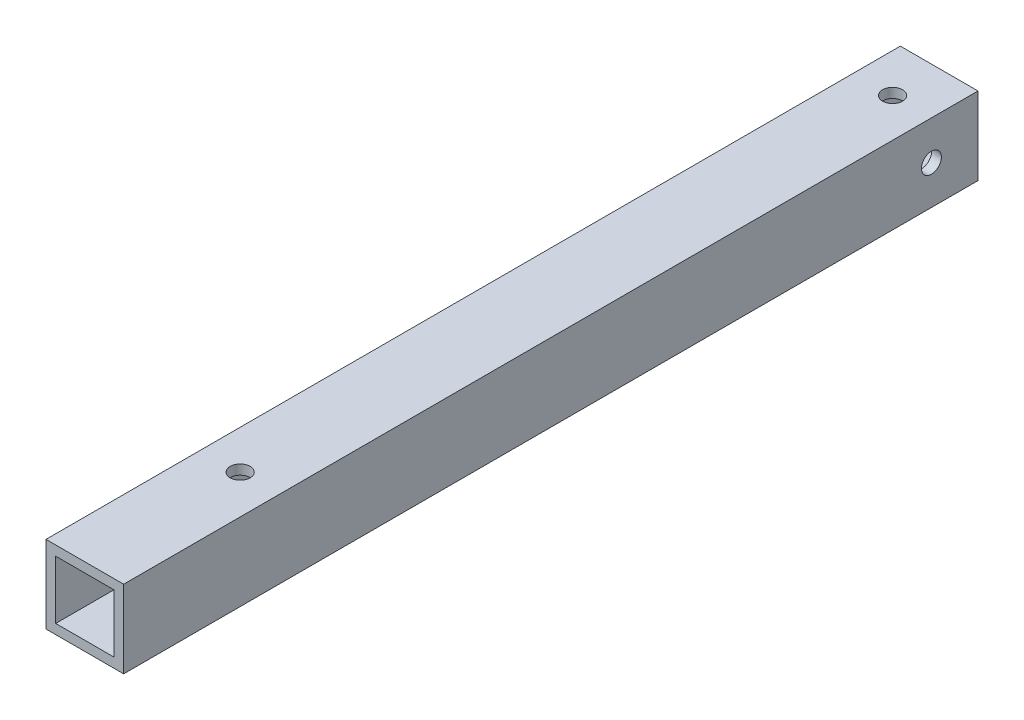
ISO-10303-21;
HEADER;
FILE_DESCRIPTION(('STEP AP214'),'2;1');
FILE_NAME('part.step','',(''),(''),'','','');
FILE_SCHEMA(('AUTOMOTIVE_DESIGN { 1 0 10303 214 1 1 1 1 }'));
ENDSEC;
DATA;
#1=APPLICATION_CONTEXT('core data for automotive mechanical design processes');
#2=APPLICATION_PROTOCOL_DEFINITION('international standard','automotive_design',2000,#1);
#3=PRODUCT_CONTEXT('',#1,'mechanical');
#4=PRODUCT('Part','Part','',(#3));
#5=PRODUCT_RELATED_PRODUCT_CATEGORY('part','',(#4));
#6=PRODUCT_DEFINITION_FORMATION('','',#4);
#7=PRODUCT_DEFINITION_CONTEXT('part definition',#1,'design');
#8=PRODUCT_DEFINITION('design','',#6,#7);
#9=PRODUCT_DEFINITION_SHAPE('','',#8);
#10=(LENGTH_UNIT() NAMED_UNIT(*) SI_UNIT(.MILLI.,.METRE.));
#11=(NAMED_UNIT(*) PLANE_ANGLE_UNIT() SI_UNIT($,.RADIAN.));
#12=(NAMED_UNIT(*) SI_UNIT($,.STERADIAN.) SOLID_ANGLE_UNIT());
#13=UNCERTAINTY_MEASURE_WITH_UNIT(LENGTH_MEASURE(1.E-05),#10,'distance_accuracy_value','');
#14=(GEOMETRIC_REPRESENTATION_CONTEXT(3) GLOBAL_UNCERTAINTY_ASSIGNED_CONTEXT((#13)) GLOBAL_UNIT_ASSIGNED_CONTEXT((#10,
#11,#12)) REPRESENTATION_CONTEXT('',''));
#15=CARTESIAN_POINT('',(0.,0.,0.));
#16=DIRECTION('',(0.,0.,1.));
#17=DIRECTION('',(1.,0.,0.));
#18=AXIS2_PLACEMENT_3D('',#15,#16,#17);
#19=CARTESIAN_POINT('',(0.,0.,279.4));
#20=DIRECTION('',(0.,0.,-1.));
#21=DIRECTION('',(-1.,0.,0.));
#22=AXIS2_PLACEMENT_3D('',#19,#20,#21);
#23=PLANE('',#22);
#24=DIRECTION('',(-1.,0.,0.));
#25=VECTOR('',#24,1.);
#26=CARTESIAN_POINT('',(12.7000000000001,-12.7,279.4));
#27=LINE('',#26,#25);
#28=CARTESIAN_POINT('',(12.7000000000001,-12.7,279.4));
#29=VERTEX_POINT('',#28);
#30=CARTESIAN_POINT('',(-12.6999999999999,-12.7,279.4));
#31=VERTEX_POINT('',#30);
#32=EDGE_CURVE('E143',#29,#31,#27,.T.);
#33=ORIENTED_EDGE('',*,*,#32,.F.);
#34=DIRECTION('',(0.,1.,0.));
#35=VECTOR('',#34,1.);
#36=CARTESIAN_POINT('',(12.7000000000001,-12.7,279.4));
#37=LINE('',#36,#35);
#38=CARTESIAN_POINT('',(12.7000000000001,12.7,279.4));
#39=VERTEX_POINT('',#38);
#40=EDGE_CURVE('E152',#29,#39,#37,.T.);
#41=ORIENTED_EDGE('',*,*,#40,.T.);
#42=DIRECTION('',(-1.,0.,0.));
#43=VECTOR('',#42,1.);
#44=CARTESIAN_POINT('',(12.7000000000001,12.7,279.4));
#45=LINE('',#44,#43);
#46=CARTESIAN_POINT('',(-12.6999999999999,12.7,279.4));
#47=VERTEX_POINT('',#46);
#48=EDGE_CURVE('E150',#39,#47,#45,.T.);
#49=ORIENTED_EDGE('',*,*,#48,.T.);
#50=DIRECTION('',(0.,1.,0.));
#51=VECTOR('',#50,1.);
#52=CARTESIAN_POINT('',(-12.6999999999999,-12.7,279.4));
#53=LINE('',#52,#51);
#54=EDGE_CURVE('E146',#31,#47,#53,.T.);
#55=ORIENTED_EDGE('',*,*,#54,.F.);
#56=EDGE_LOOP('',(#33,#41,#49,#55));
#57=FACE_BOUND('',#56,.T.);
#58=DIRECTION('',(0.,1.,0.));
#59=VECTOR('',#58,1.);
#60=CARTESIAN_POINT('',(9.52500000000005,-9.52499999999999,279.4));
#61=LINE('',#60,#59);
#62=CARTESIAN_POINT('',(9.52500000000005,-9.52499999999999,279.4));
#63=VERTEX_POINT('',#62);
#64=CARTESIAN_POINT('',(9.52500000000005,9.52499999999999,279.4));
#65=VERTEX_POINT('',#64);
#66=EDGE_CURVE('E105',#63,#65,#61,.T.);
#67=ORIENTED_EDGE('',*,*,#66,.F.);
#68=DIRECTION('',(1.,0.,0.));
#69=VECTOR('',#68,1.);
#70=CARTESIAN_POINT('',(-9.52500000000006,-9.52499999999999,279.4));
#71=LINE('',#70,#69);
#72=CARTESIAN_POINT('',(-9.52500000000006,-9.52499999999999,279.4));
#73=VERTEX_POINT('',#72);
#74=EDGE_CURVE('E127',#73,#63,#71,.T.);
#75=ORIENTED_EDGE('',*,*,#74,.F.);
#76=DIRECTION('',(0.,-1.,0.));
#77=VECTOR('',#76,1.);
#78=CARTESIAN_POINT('',(-9.52500000000006,-9.52499999999999,279.4));
#79=LINE('',#78,#77);
#80=CARTESIAN_POINT('',(-9.52500000000006,9.52499999999999,279.4));
#81=VERTEX_POINT('',#80);
#82=EDGE_CURVE('E125',#81,#73,#79,.T.);
#83=ORIENTED_EDGE('',*,*,#82,.F.);
#84=DIRECTION('',(-1.,0.,0.));
#85=VECTOR('',#84,1.);
#86=CARTESIAN_POINT('',(-9.52500000000006,9.52499999999999,279.4));
#87=LINE('',#86,#85);
#88=EDGE_CURVE('E113',#65,#81,#87,.T.);
#89=ORIENTED_EDGE('',*,*,#88,.F.);
#90=EDGE_LOOP('',(#67,#75,#83,#89));
#91=FACE_BOUND('',#90,.T.);
#92=ADVANCED_FACE('F39',(#57,#91),#23,.F.);
#93=CARTESIAN_POINT('',(0.,0.,0.));
#94=DIRECTION('',(0.,0.,-1.));
#95=DIRECTION('',(-1.,0.,0.));
#96=AXIS2_PLACEMENT_3D('',#93,#94,#95);
#97=PLANE('',#96);
#98=DIRECTION('',(-1.,0.,0.));
#99=VECTOR('',#98,1.);
#100=CARTESIAN_POINT('',(12.7000000000001,-12.7,0.));
#101=LINE('',#100,#99);
#102=CARTESIAN_POINT('',(12.7000000000001,-12.7,0.));
#103=VERTEX_POINT('',#102);
#104=CARTESIAN_POINT('',(-12.6999999999999,-12.7,0.));
#105=VERTEX_POINT('',#104);
#106=EDGE_CURVE('E121',#103,#105,#101,.T.);
#107=ORIENTED_EDGE('',*,*,#106,.T.);
#108=DIRECTION('',(0.,1.,0.));
#109=VECTOR('',#108,1.);
#110=CARTESIAN_POINT('',(-12.6999999999999,-12.7,0.));
#111=LINE('',#110,#109);
#112=CARTESIAN_POINT('',(-12.6999999999999,12.7,0.));
#113=VERTEX_POINT('',#112);
#114=EDGE_CURVE('E157',#105,#113,#111,.T.);
#115=ORIENTED_EDGE('',*,*,#114,.T.);
#116=DIRECTION('',(-1.,0.,0.));
#117=VECTOR('',#116,1.);
#118=CARTESIAN_POINT('',(12.7000000000001,12.7,0.));
#119=LINE('',#118,#117);
#120=CARTESIAN_POINT('',(12.7000000000001,12.7,0.));
#121=VERTEX_POINT('',#120);
#122=EDGE_CURVE('E160',#121,#113,#119,.T.);
#123=ORIENTED_EDGE('',*,*,#122,.F.);
#124=DIRECTION('',(0.,1.,0.));
#125=VECTOR('',#124,1.);
#126=CARTESIAN_POINT('',(12.7000000000001,-12.7,0.));
#127=LINE('',#126,#125);
#128=EDGE_CURVE('E147',#103,#121,#127,.T.);
#129=ORIENTED_EDGE('',*,*,#128,.F.);
#130=EDGE_LOOP('',(#107,#115,#123,#129));
#131=FACE_BOUND('',#130,.T.);
#132=DIRECTION('',(1.,0.,0.));
#133=VECTOR('',#132,1.);
#134=CARTESIAN_POINT('',(-9.52500000000006,-9.52499999999999,0.));
#135=LINE('',#134,#133);
#136=CARTESIAN_POINT('',(-9.52500000000006,-9.52499999999999,0.));
#137=VERTEX_POINT('',#136);
#138=CARTESIAN_POINT('',(9.52500000000005,-9.52499999999999,0.));
#139=VERTEX_POINT('',#138);
#140=EDGE_CURVE('E114',#137,#139,#135,.T.);
#141=ORIENTED_EDGE('',*,*,#140,.T.);
#142=DIRECTION('',(0.,1.,0.));
#143=VECTOR('',#142,1.);
#144=CARTESIAN_POINT('',(9.52500000000005,-9.52499999999999,0.));
#145=LINE('',#144,#143);
#146=CARTESIAN_POINT('',(9.52500000000005,9.52499999999999,0.));
#147=VERTEX_POINT('',#146);
#148=EDGE_CURVE('E64',#139,#147,#145,.T.);
#149=ORIENTED_EDGE('',*,*,#148,.T.);
#150=DIRECTION('',(-1.,0.,0.));
#151=VECTOR('',#150,1.);
#152=CARTESIAN_POINT('',(-9.52500000000006,9.52499999999999,0.));
#153=LINE('',#152,#151);
#154=CARTESIAN_POINT('',(-9.52500000000006,9.52499999999999,0.));
#155=VERTEX_POINT('',#154);
#156=EDGE_CURVE('E120',#147,#155,#153,.T.);
#157=ORIENTED_EDGE('',*,*,#156,.T.);
#158=DIRECTION('',(0.,-1.,0.));
#159=VECTOR('',#158,1.);
#160=CARTESIAN_POINT('',(-9.52500000000006,-9.52499999999999,0.));
#161=LINE('',#160,#159);
#162=EDGE_CURVE('E135',#155,#137,#161,.T.);
#163=ORIENTED_EDGE('',*,*,#162,.T.);
#164=EDGE_LOOP('',(#141,#149,#157,#163));
#165=FACE_BOUND('',#164,.T.);
#166=ADVANCED_FACE('F217',(#131,#165),#97,.T.);
#167=CARTESIAN_POINT('',(12.7000000000001,-12.7,279.4));
#168=DIRECTION('',(0.,-1.,0.));
#169=DIRECTION('',(0.,0.,-1.));
#170=AXIS2_PLACEMENT_3D('',#167,#168,#169);
#171=PLANE('',#170);
#172=CARTESIAN_POINT('',(0.,-12.7,228.6));
#173=DIRECTION('',(0.,1.,0.));
#174=DIRECTION('',(0.,0.,1.));
#175=AXIS2_PLACEMENT_3D('',#172,#173,#174);
#176=CIRCLE('',#175,3.2639);
#177=CARTESIAN_POINT('',(0.,-12.7,231.8639));
#178=VERTEX_POINT('',#177);
#179=EDGE_CURVE('E175',#178,#178,#176,.T.);
#180=ORIENTED_EDGE('',*,*,#179,.T.);
#181=EDGE_LOOP('',(#180));
#182=FACE_BOUND('',#181,.T.);
#183=CARTESIAN_POINT('',(0.,-12.7,15.24));
#184=DIRECTION('',(0.,1.,0.));
#185=DIRECTION('',(0.,0.,1.));
#186=AXIS2_PLACEMENT_3D('',#183,#184,#185);
#187=CIRCLE('',#186,3.2639);
#188=CARTESIAN_POINT('',(0.,-12.7,18.5039));
#189=VERTEX_POINT('',#188);
#190=EDGE_CURVE('E171',#189,#189,#187,.T.);
#191=ORIENTED_EDGE('',*,*,#190,.T.);
#192=EDGE_LOOP('',(#191));
#193=FACE_BOUND('',#192,.T.);
#194=ORIENTED_EDGE('',*,*,#106,.F.);
#195=DIRECTION('',(0.,0.,-1.));
#196=VECTOR('',#195,1.);
#197=CARTESIAN_POINT('',(12.7000000000001,-12.7,279.4));
#198=LINE('',#197,#196);
#199=EDGE_CURVE('E11',#29,#103,#198,.T.);
#200=ORIENTED_EDGE('',*,*,#199,.F.);
#201=ORIENTED_EDGE('',*,*,#32,.T.);
#202=DIRECTION('',(0.,0.,-1.));
#203=VECTOR('',#202,1.);
#204=CARTESIAN_POINT('',(-12.6999999999999,-12.7,279.4));
#205=LINE('',#204,#203);
#206=EDGE_CURVE('E154',#31,#105,#205,.T.);
#207=ORIENTED_EDGE('',*,*,#206,.T.);
#208=EDGE_LOOP('',(#194,#200,#201,#207));
#209=FACE_BOUND('',#208,.T.);
#210=ADVANCED_FACE('F41',(#182,#193,#209),#171,.T.);
#211=CARTESIAN_POINT('',(12.7000000000001,-12.7,279.4));
#212=DIRECTION('',(-1.,0.,0.));
#213=DIRECTION('',(0.,0.,1.));
#214=AXIS2_PLACEMENT_3D('',#211,#212,#213);
#215=PLANE('',#214);
#216=CARTESIAN_POINT('',(12.7000000000001,0.,15.24));
#217=DIRECTION('',(-1.,0.,0.));
#218=DIRECTION('',(0.,0.,1.));
#219=AXIS2_PLACEMENT_3D('',#216,#217,#218);
#220=CIRCLE('',#219,3.2639);
#221=CARTESIAN_POINT('',(12.7000000000001,0.,18.5039));
#222=VERTEX_POINT('',#221);
#223=EDGE_CURVE('E289',#222,#222,#220,.T.);
#224=ORIENTED_EDGE('',*,*,#223,.T.);
#225=EDGE_LOOP('',(#224));
#226=FACE_BOUND('',#225,.T.);
#227=ORIENTED_EDGE('',*,*,#128,.T.);
#228=DIRECTION('',(0.,0.,-1.));
#229=VECTOR('',#228,1.);
#230=CARTESIAN_POINT('',(12.7000000000001,12.7,279.4));
#231=LINE('',#230,#229);
#232=EDGE_CURVE('E48',#39,#121,#231,.T.);
#233=ORIENTED_EDGE('',*,*,#232,.F.);
#234=ORIENTED_EDGE('',*,*,#40,.F.);
#235=ORIENTED_EDGE('',*,*,#199,.T.);
#236=EDGE_LOOP('',(#227,#233,#234,#235));
#237=FACE_BOUND('',#236,.T.);
#238=ADVANCED_FACE('F227',(#226,#237),#215,.F.);
#239=CARTESIAN_POINT('',(12.7000000000001,12.7,279.4));
#240=DIRECTION('',(0.,-1.,0.));
#241=DIRECTION('',(0.,0.,-1.));
#242=AXIS2_PLACEMENT_3D('',#239,#240,#241);
#243=PLANE('',#242);
#244=CARTESIAN_POINT('',(0.,12.7,228.6));
#245=DIRECTION('',(0.,1.,0.));
#246=DIRECTION('',(0.,0.,1.));
#247=AXIS2_PLACEMENT_3D('',#244,#245,#246);
#248=CIRCLE('',#247,3.2639);
#249=CARTESIAN_POINT('',(0.,12.7,231.8639));
#250=VERTEX_POINT('',#249);
#251=EDGE_CURVE('E182',#250,#250,#248,.T.);
#252=ORIENTED_EDGE('',*,*,#251,.F.);
#253=EDGE_LOOP('',(#252));
#254=FACE_BOUND('',#253,.T.);
#255=CARTESIAN_POINT('',(0.,12.7,15.24));
#256=DIRECTION('',(0.,1.,0.));
#257=DIRECTION('',(0.,0.,1.));
#258=AXIS2_PLACEMENT_3D('',#255,#256,#257);
#259=CIRCLE('',#258,3.2639);
#260=CARTESIAN_POINT('',(0.,12.7,18.5039));
#261=VERTEX_POINT('',#260);
#262=EDGE_CURVE('E179',#261,#261,#259,.T.);
#263=ORIENTED_EDGE('',*,*,#262,.F.);
#264=EDGE_LOOP('',(#263));
#265=FACE_BOUND('',#264,.T.);
#266=ORIENTED_EDGE('',*,*,#122,.T.);
#267=DIRECTION('',(0.,0.,-1.));
#268=VECTOR('',#267,1.);
#269=CARTESIAN_POINT('',(-12.6999999999999,12.7,279.4));
#270=LINE('',#269,#268);
#271=EDGE_CURVE('E166',#47,#113,#270,.T.);
#272=ORIENTED_EDGE('',*,*,#271,.F.);
#273=ORIENTED_EDGE('',*,*,#48,.F.);
#274=ORIENTED_EDGE('',*,*,#232,.T.);
#275=EDGE_LOOP('',(#266,#272,#273,#274));
#276=FACE_BOUND('',#275,.T.);
#277=ADVANCED_FACE('F230',(#254,#265,#276),#243,.F.);
#278=CARTESIAN_POINT('',(-12.6999999999999,-12.7,279.4));
#279=DIRECTION('',(-1.,0.,0.));
#280=DIRECTION('',(0.,0.,1.));
#281=AXIS2_PLACEMENT_3D('',#278,#279,#280);
#282=PLANE('',#281);
#283=CARTESIAN_POINT('',(-12.6999999999999,0.,15.24));
#284=DIRECTION('',(-1.,0.,0.));
#285=DIRECTION('',(0.,0.,1.));
#286=AXIS2_PLACEMENT_3D('',#283,#284,#285);
#287=CIRCLE('',#286,3.2639);
#288=CARTESIAN_POINT('',(-12.6999999999999,0.,18.5039));
#289=VERTEX_POINT('',#288);
#290=EDGE_CURVE('E241',#289,#289,#287,.T.);
#291=ORIENTED_EDGE('',*,*,#290,.F.);
#292=EDGE_LOOP('',(#291));
#293=FACE_BOUND('',#292,.T.);
#294=ORIENTED_EDGE('',*,*,#114,.F.);
#295=ORIENTED_EDGE('',*,*,#206,.F.);
#296=ORIENTED_EDGE('',*,*,#54,.T.);
#297=ORIENTED_EDGE('',*,*,#271,.T.);
#298=EDGE_LOOP('',(#294,#295,#296,#297));
#299=FACE_BOUND('',#298,.T.);
#300=ADVANCED_FACE('F212',(#293,#299),#282,.T.);
#301=CARTESIAN_POINT('',(9.52500000000005,-9.52499999999999,279.4));
#302=DIRECTION('',(-1.,0.,0.));
#303=DIRECTION('',(0.,0.,1.));
#304=AXIS2_PLACEMENT_3D('',#301,#302,#303);
#305=PLANE('',#304);
#306=CARTESIAN_POINT('',(9.52500000000005,0.,15.24));
#307=DIRECTION('',(-1.,0.,0.));
#308=DIRECTION('',(0.,0.,1.));
#309=AXIS2_PLACEMENT_3D('',#306,#307,#308);
#310=CIRCLE('',#309,3.2639);
#311=CARTESIAN_POINT('',(9.52500000000005,0.,18.5039));
#312=VERTEX_POINT('',#311);
#313=EDGE_CURVE('E187',#312,#312,#310,.T.);
#314=ORIENTED_EDGE('',*,*,#313,.F.);
#315=EDGE_LOOP('',(#314));
#316=FACE_BOUND('',#315,.T.);
#317=ORIENTED_EDGE('',*,*,#148,.F.);
#318=DIRECTION('',(0.,0.,-1.));
#319=VECTOR('',#318,1.);
#320=CARTESIAN_POINT('',(9.52500000000005,-9.52499999999999,279.4));
#321=LINE('',#320,#319);
#322=EDGE_CURVE('E109',#63,#139,#321,.T.);
#323=ORIENTED_EDGE('',*,*,#322,.F.);
#324=ORIENTED_EDGE('',*,*,#66,.T.);
#325=DIRECTION('',(0.,0.,-1.));
#326=VECTOR('',#325,1.);
#327=CARTESIAN_POINT('',(9.52500000000005,9.52499999999999,279.4));
#328=LINE('',#327,#326);
#329=EDGE_CURVE('E108',#65,#147,#328,.T.);
#330=ORIENTED_EDGE('',*,*,#329,.T.);
#331=EDGE_LOOP('',(#317,#323,#324,#330));
#332=FACE_BOUND('',#331,.T.);
#333=ADVANCED_FACE('F107',(#316,#332),#305,.T.);
#334=CARTESIAN_POINT('',(-9.52500000000006,9.52499999999999,279.4));
#335=DIRECTION('',(0.,-1.,0.));
#336=DIRECTION('',(0.,0.,-1.));
#337=AXIS2_PLACEMENT_3D('',#334,#335,#336);
#338=PLANE('',#337);
#339=CARTESIAN_POINT('',(0.,9.52499999999999,228.6));
#340=DIRECTION('',(0.,-1.,0.));
#341=DIRECTION('',(0.,0.,-1.));
#342=AXIS2_PLACEMENT_3D('',#339,#340,#341);
#343=CIRCLE('',#342,3.2639);
#344=CARTESIAN_POINT('',(0.,9.52499999999999,225.3361));
#345=VERTEX_POINT('',#344);
#346=EDGE_CURVE('E174',#345,#345,#343,.T.);
#347=ORIENTED_EDGE('',*,*,#346,.F.);
#348=EDGE_LOOP('',(#347));
#349=FACE_BOUND('',#348,.T.);
#350=CARTESIAN_POINT('',(0.,9.52499999999999,15.24));
#351=DIRECTION('',(0.,-1.,0.));
#352=DIRECTION('',(0.,0.,-1.));
#353=AXIS2_PLACEMENT_3D('',#350,#351,#352);
#354=CIRCLE('',#353,3.2639);
#355=CARTESIAN_POINT('',(0.,9.52499999999999,11.9761));
#356=VERTEX_POINT('',#355);
#357=EDGE_CURVE('E133',#356,#356,#354,.T.);
#358=ORIENTED_EDGE('',*,*,#357,.F.);
#359=EDGE_LOOP('',(#358));
#360=FACE_BOUND('',#359,.T.);
#361=ORIENTED_EDGE('',*,*,#156,.F.);
#362=ORIENTED_EDGE('',*,*,#329,.F.);
#363=ORIENTED_EDGE('',*,*,#88,.T.);
#364=DIRECTION('',(0.,0.,-1.));
#365=VECTOR('',#364,1.);
#366=CARTESIAN_POINT('',(-9.52500000000006,9.52499999999999,279.4));
#367=LINE('',#366,#365);
#368=EDGE_CURVE('E122',#81,#155,#367,.T.);
#369=ORIENTED_EDGE('',*,*,#368,.T.);
#370=EDGE_LOOP('',(#361,#362,#363,#369));
#371=FACE_BOUND('',#370,.T.);
#372=ADVANCED_FACE('F117',(#349,#360,#371),#338,.T.);
#373=CARTESIAN_POINT('',(-9.52500000000006,-9.52499999999999,279.4));
#374=DIRECTION('',(1.,0.,0.));
#375=DIRECTION('',(0.,0.,-1.));
#376=AXIS2_PLACEMENT_3D('',#373,#374,#375);
#377=PLANE('',#376);
#378=CARTESIAN_POINT('',(-9.52500000000006,0.,15.24));
#379=DIRECTION('',(1.,0.,0.));
#380=DIRECTION('',(0.,0.,-1.));
#381=AXIS2_PLACEMENT_3D('',#378,#379,#380);
#382=CIRCLE('',#381,3.2639);
#383=CARTESIAN_POINT('',(-9.52500000000006,0.,11.9761));
#384=VERTEX_POINT('',#383);
#385=EDGE_CURVE('E43',#384,#384,#382,.T.);
#386=ORIENTED_EDGE('',*,*,#385,.F.);
#387=EDGE_LOOP('',(#386));
#388=FACE_BOUND('',#387,.T.);
#389=ORIENTED_EDGE('',*,*,#162,.F.);
#390=ORIENTED_EDGE('',*,*,#368,.F.);
#391=ORIENTED_EDGE('',*,*,#82,.T.);
#392=DIRECTION('',(0.,0.,-1.));
#393=VECTOR('',#392,1.);
#394=CARTESIAN_POINT('',(-9.52500000000006,-9.52499999999999,279.4));
#395=LINE('',#394,#393);
#396=EDGE_CURVE('E56',#73,#137,#395,.T.);
#397=ORIENTED_EDGE('',*,*,#396,.T.);
#398=EDGE_LOOP('',(#389,#390,#391,#397));
#399=FACE_BOUND('',#398,.T.);
#400=ADVANCED_FACE('F202',(#388,#399),#377,.T.);
#401=CARTESIAN_POINT('',(-9.52500000000006,-9.52499999999999,279.4));
#402=DIRECTION('',(0.,1.,0.));
#403=DIRECTION('',(0.,0.,1.));
#404=AXIS2_PLACEMENT_3D('',#401,#402,#403);
#405=PLANE('',#404);
#406=CARTESIAN_POINT('',(0.,-9.52499999999999,228.6));
#407=DIRECTION('',(0.,1.,0.));
#408=DIRECTION('',(0.,0.,1.));
#409=AXIS2_PLACEMENT_3D('',#406,#407,#408);
#410=CIRCLE('',#409,3.2639);
#411=CARTESIAN_POINT('',(0.,-9.52499999999999,231.8639));
#412=VERTEX_POINT('',#411);
#413=EDGE_CURVE('E172',#412,#412,#410,.T.);
#414=ORIENTED_EDGE('',*,*,#413,.F.);
#415=EDGE_LOOP('',(#414));
#416=FACE_BOUND('',#415,.T.);
#417=CARTESIAN_POINT('',(0.,-9.52499999999999,15.24));
#418=DIRECTION('',(0.,1.,0.));
#419=DIRECTION('',(0.,0.,1.));
#420=AXIS2_PLACEMENT_3D('',#417,#418,#419);
#421=CIRCLE('',#420,3.2639);
#422=CARTESIAN_POINT('',(0.,-9.52499999999999,18.5039));
#423=VERTEX_POINT('',#422);
#424=EDGE_CURVE('E169',#423,#423,#421,.T.);
#425=ORIENTED_EDGE('',*,*,#424,.F.);
#426=EDGE_LOOP('',(#425));
#427=FACE_BOUND('',#426,.T.);
#428=ORIENTED_EDGE('',*,*,#140,.F.);
#429=ORIENTED_EDGE('',*,*,#396,.F.);
#430=ORIENTED_EDGE('',*,*,#74,.T.);
#431=ORIENTED_EDGE('',*,*,#322,.T.);
#432=EDGE_LOOP('',(#428,#429,#430,#431));
#433=FACE_BOUND('',#432,.T.);
#434=ADVANCED_FACE('F209',(#416,#427,#433),#405,.T.);
#435=CARTESIAN_POINT('',(0.,-12.7,15.24));
#436=DIRECTION('',(0.,1.,0.));
#437=DIRECTION('',(0.,0.,1.));
#438=AXIS2_PLACEMENT_3D('',#435,#436,#437);
#439=CYLINDRICAL_SURFACE('',#438,3.2639);
#440=ORIENTED_EDGE('',*,*,#424,.T.);
#441=EDGE_LOOP('',(#440));
#442=FACE_BOUND('',#441,.T.);
#443=ORIENTED_EDGE('',*,*,#190,.F.);
#444=EDGE_LOOP('',(#443));
#445=FACE_BOUND('',#444,.T.);
#446=ADVANCED_FACE('F261',(#442,#445),#439,.F.);
#447=ORIENTED_EDGE('',*,*,#357,.T.);
#448=EDGE_LOOP('',(#447));
#449=FACE_BOUND('',#448,.T.);
#450=ORIENTED_EDGE('',*,*,#262,.T.);
#451=EDGE_LOOP('',(#450));
#452=FACE_BOUND('',#451,.T.);
#453=ADVANCED_FACE('F198',(#449,#452),#439,.F.);
#454=CARTESIAN_POINT('',(0.,-12.7,228.6));
#455=DIRECTION('',(0.,1.,0.));
#456=DIRECTION('',(0.,0.,1.));
#457=AXIS2_PLACEMENT_3D('',#454,#455,#456);
#458=CYLINDRICAL_SURFACE('',#457,3.2639);
#459=ORIENTED_EDGE('',*,*,#413,.T.);
#460=EDGE_LOOP('',(#459));
#461=FACE_BOUND('',#460,.T.);
#462=ORIENTED_EDGE('',*,*,#179,.F.);
#463=EDGE_LOOP('',(#462));
#464=FACE_BOUND('',#463,.T.);
#465=ADVANCED_FACE('F269',(#461,#464),#458,.F.);
#466=ORIENTED_EDGE('',*,*,#346,.T.);
#467=EDGE_LOOP('',(#466));
#468=FACE_BOUND('',#467,.T.);
#469=ORIENTED_EDGE('',*,*,#251,.T.);
#470=EDGE_LOOP('',(#469));
#471=FACE_BOUND('',#470,.T.);
#472=ADVANCED_FACE('F275',(#468,#471),#458,.F.);
#473=CARTESIAN_POINT('',(12.7000000000001,0.,15.24));
#474=DIRECTION('',(-1.,0.,0.));
#475=DIRECTION('',(0.,0.,1.));
#476=AXIS2_PLACEMENT_3D('',#473,#474,#475);
#477=CYLINDRICAL_SURFACE('',#476,3.2639);
#478=ORIENTED_EDGE('',*,*,#385,.T.);
#479=EDGE_LOOP('',(#478));
#480=FACE_BOUND('',#479,.T.);
#481=ORIENTED_EDGE('',*,*,#290,.T.);
#482=EDGE_LOOP('',(#481));
#483=FACE_BOUND('',#482,.T.);
#484=ADVANCED_FACE('F276',(#480,#483),#477,.F.);
#485=ORIENTED_EDGE('',*,*,#313,.T.);
#486=EDGE_LOOP('',(#485));
#487=FACE_BOUND('',#486,.T.);
#488=ORIENTED_EDGE('',*,*,#223,.F.);
#489=EDGE_LOOP('',(#488));
#490=FACE_BOUND('',#489,.T.);
#491=ADVANCED_FACE('F278',(#487,#490),#477,.F.);
#492=CLOSED_SHELL('',(#92,#166,#210,#238,#277,#300,#333,#372,#400,#434,#446,#453,#465,#472,#484,#491));
#493=MANIFOLD_SOLID_BREP('B2',#492);
#494=ADVANCED_BREP_SHAPE_REPRESENTATION('',(#18,#493),#14);
#495=SHAPE_DEFINITION_REPRESENTATION(#9,#494);
ENDSEC;
END-ISO-10303-21;
